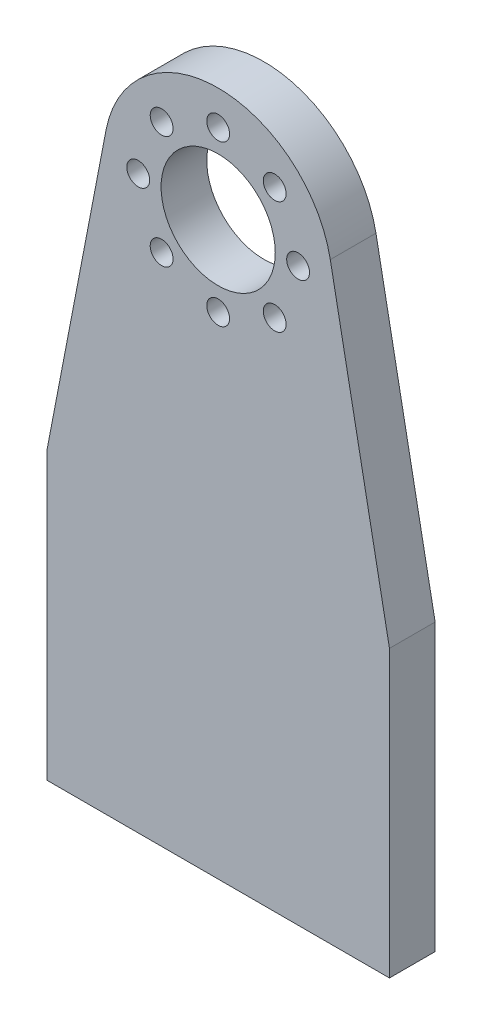
ISO-10303-21;
HEADER;
FILE_DESCRIPTION(('STEP AP214'),'2;1');
FILE_NAME('part.step','',(''),(''),'','','');
FILE_SCHEMA(('AUTOMOTIVE_DESIGN { 1 0 10303 214 1 1 1 1 }'));
ENDSEC;
DATA;
#1=APPLICATION_CONTEXT('core data for automotive mechanical design processes');
#2=APPLICATION_PROTOCOL_DEFINITION('international standard','automotive_design',2000,#1);
#3=PRODUCT_CONTEXT('',#1,'mechanical');
#4=PRODUCT('Part','Part','',(#3));
#5=PRODUCT_RELATED_PRODUCT_CATEGORY('part','',(#4));
#6=PRODUCT_DEFINITION_FORMATION('','',#4);
#7=PRODUCT_DEFINITION_CONTEXT('part definition',#1,'design');
#8=PRODUCT_DEFINITION('design','',#6,#7);
#9=PRODUCT_DEFINITION_SHAPE('','',#8);
#10=(LENGTH_UNIT() NAMED_UNIT(*) SI_UNIT(.MILLI.,.METRE.));
#11=(NAMED_UNIT(*) PLANE_ANGLE_UNIT() SI_UNIT($,.RADIAN.));
#12=(NAMED_UNIT(*) SI_UNIT($,.STERADIAN.) SOLID_ANGLE_UNIT());
#13=UNCERTAINTY_MEASURE_WITH_UNIT(LENGTH_MEASURE(1.E-05),#10,'distance_accuracy_value','');
#14=(GEOMETRIC_REPRESENTATION_CONTEXT(3) GLOBAL_UNCERTAINTY_ASSIGNED_CONTEXT((#13)) GLOBAL_UNIT_ASSIGNED_CONTEXT((#10,
#11,#12)) REPRESENTATION_CONTEXT('',''));
#15=CARTESIAN_POINT('',(0.,0.,0.));
#16=DIRECTION('',(0.,0.,1.));
#17=DIRECTION('',(1.,0.,0.));
#18=AXIS2_PLACEMENT_3D('',#15,#16,#17);
#19=CARTESIAN_POINT('',(0.,17.1036781290334,4.));
#20=DIRECTION('',(0.,0.,-1.));
#21=DIRECTION('',(-1.,0.,0.));
#22=AXIS2_PLACEMENT_3D('',#19,#20,#21);
#23=PLANE('',#22);
#24=DIRECTION('',(1.,0.,0.));
#25=VECTOR('',#24,1.);
#26=CARTESIAN_POINT('',(-15.,-32.8963218709666,4.));
#27=LINE('',#26,#25);
#28=CARTESIAN_POINT('',(-15.,-32.8963218709666,4.));
#29=VERTEX_POINT('',#28);
#30=CARTESIAN_POINT('',(15.,-32.8963218709666,4.));
#31=VERTEX_POINT('',#30);
#32=EDGE_CURVE('E128',#29,#31,#27,.T.);
#33=ORIENTED_EDGE('',*,*,#32,.T.);
#34=DIRECTION('',(0.,1.,0.));
#35=VECTOR('',#34,1.);
#36=CARTESIAN_POINT('',(15.,-7.89632187096661,4.));
#37=LINE('',#36,#35);
#38=CARTESIAN_POINT('',(15.,-7.89632187096661,4.));
#39=VERTEX_POINT('',#38);
#40=EDGE_CURVE('E86',#31,#39,#37,.T.);
#41=ORIENTED_EDGE('',*,*,#40,.T.);
#42=DIRECTION('',(-0.189166962504559,0.981944937507597,0.));
#43=VECTOR('',#42,1.);
#44=CARTESIAN_POINT('',(15.,-7.89632187096661,4.));
#45=LINE('',#44,#43);
#46=CARTESIAN_POINT('',(9.81944937507597,18.995347754079,4.));
#47=VERTEX_POINT('',#46);
#48=EDGE_CURVE('E99',#39,#47,#45,.T.);
#49=ORIENTED_EDGE('',*,*,#48,.T.);
#50=CARTESIAN_POINT('',(0.,17.1036781290334,4.));
#51=DIRECTION('',(0.,0.,1.));
#52=DIRECTION('',(-1.,0.,0.));
#53=AXIS2_PLACEMENT_3D('',#50,#51,#52);
#54=CIRCLE('',#53,9.99999999999999);
#55=CARTESIAN_POINT('',(-9.81944937507597,18.995347754079,4.));
#56=VERTEX_POINT('',#55);
#57=EDGE_CURVE('E93',#47,#56,#54,.T.);
#58=ORIENTED_EDGE('',*,*,#57,.T.);
#59=DIRECTION('',(-0.189166962504559,-0.981944937507597,0.));
#60=VECTOR('',#59,1.);
#61=CARTESIAN_POINT('',(-15.,-7.89632187096662,4.));
#62=LINE('',#61,#60);
#63=CARTESIAN_POINT('',(-15.,-7.89632187096662,4.));
#64=VERTEX_POINT('',#63);
#65=EDGE_CURVE('E97',#56,#64,#62,.T.);
#66=ORIENTED_EDGE('',*,*,#65,.T.);
#67=DIRECTION('',(0.,-1.,0.));
#68=VECTOR('',#67,1.);
#69=CARTESIAN_POINT('',(-15.,-7.89632187096662,4.));
#70=LINE('',#69,#68);
#71=EDGE_CURVE('E49',#64,#29,#70,.T.);
#72=ORIENTED_EDGE('',*,*,#71,.T.);
#73=EDGE_LOOP('',(#33,#41,#49,#58,#66,#72));
#74=FACE_BOUND('',#73,.T.);
#75=CARTESIAN_POINT('',(0.,24.1036781290334,4.));
#76=DIRECTION('',(0.,0.,1.));
#77=DIRECTION('',(1.,0.,0.));
#78=AXIS2_PLACEMENT_3D('',#75,#76,#77);
#79=CIRCLE('',#78,1.);
#80=CARTESIAN_POINT('',(1.,24.1036781290334,4.));
#81=VERTEX_POINT('',#80);
#82=EDGE_CURVE('E121',#81,#81,#79,.T.);
#83=ORIENTED_EDGE('',*,*,#82,.F.);
#84=EDGE_LOOP('',(#83));
#85=FACE_BOUND('',#84,.T.);
#86=CARTESIAN_POINT('',(0.,17.1036781290334,4.));
#87=DIRECTION('',(0.,0.,1.));
#88=DIRECTION('',(1.,0.,0.));
#89=AXIS2_PLACEMENT_3D('',#86,#87,#88);
#90=CIRCLE('',#89,5.);
#91=CARTESIAN_POINT('',(5.,17.1036781290334,4.));
#92=VERTEX_POINT('',#91);
#93=EDGE_CURVE('E242',#92,#92,#90,.T.);
#94=ORIENTED_EDGE('',*,*,#93,.F.);
#95=EDGE_LOOP('',(#94));
#96=FACE_BOUND('',#95,.T.);
#97=CARTESIAN_POINT('',(4.94974746830587,22.0534255973393,4.));
#98=DIRECTION('',(0.,0.,1.));
#99=DIRECTION('',(1.,0.,0.));
#100=AXIS2_PLACEMENT_3D('',#97,#98,#99);
#101=CIRCLE('',#100,1.);
#102=CARTESIAN_POINT('',(5.94974746830587,22.0534255973393,4.));
#103=VERTEX_POINT('',#102);
#104=EDGE_CURVE('E236',#103,#103,#101,.T.);
#105=ORIENTED_EDGE('',*,*,#104,.F.);
#106=EDGE_LOOP('',(#105));
#107=FACE_BOUND('',#106,.T.);
#108=CARTESIAN_POINT('',(7.0000000000001,17.1036781290335,4.));
#109=DIRECTION('',(0.,0.,1.));
#110=DIRECTION('',(1.,0.,0.));
#111=AXIS2_PLACEMENT_3D('',#108,#109,#110);
#112=CIRCLE('',#111,1.);
#113=CARTESIAN_POINT('',(8.0000000000001,17.1036781290335,4.));
#114=VERTEX_POINT('',#113);
#115=EDGE_CURVE('E230',#114,#114,#112,.T.);
#116=ORIENTED_EDGE('',*,*,#115,.F.);
#117=EDGE_LOOP('',(#116));
#118=FACE_BOUND('',#117,.T.);
#119=CARTESIAN_POINT('',(4.94974746830597,12.1539306607276,4.));
#120=DIRECTION('',(0.,0.,1.));
#121=DIRECTION('',(1.,0.,0.));
#122=AXIS2_PLACEMENT_3D('',#119,#120,#121);
#123=CIRCLE('',#122,1.);
#124=CARTESIAN_POINT('',(5.94974746830597,12.1539306607276,4.));
#125=VERTEX_POINT('',#124);
#126=EDGE_CURVE('E224',#125,#125,#123,.T.);
#127=ORIENTED_EDGE('',*,*,#126,.F.);
#128=EDGE_LOOP('',(#127));
#129=FACE_BOUND('',#128,.T.);
#130=CARTESIAN_POINT('',(1.46642216231412E-13,10.1036781290334,4.));
#131=DIRECTION('',(0.,0.,1.));
#132=DIRECTION('',(1.,0.,0.));
#133=AXIS2_PLACEMENT_3D('',#130,#131,#132);
#134=CIRCLE('',#133,1.);
#135=CARTESIAN_POINT('',(1.00000000000015,10.1036781290334,4.));
#136=VERTEX_POINT('',#135);
#137=EDGE_CURVE('E218',#136,#136,#134,.T.);
#138=ORIENTED_EDGE('',*,*,#137,.F.);
#139=EDGE_LOOP('',(#138));
#140=FACE_BOUND('',#139,.T.);
#141=CARTESIAN_POINT('',(-4.94974746830571,12.1539306607275,4.));
#142=DIRECTION('',(0.,0.,1.));
#143=DIRECTION('',(1.,0.,0.));
#144=AXIS2_PLACEMENT_3D('',#141,#142,#143);
#145=CIRCLE('',#144,1.);
#146=CARTESIAN_POINT('',(-3.94974746830571,12.1539306607275,4.));
#147=VERTEX_POINT('',#146);
#148=EDGE_CURVE('E212',#147,#147,#145,.T.);
#149=ORIENTED_EDGE('',*,*,#148,.F.);
#150=EDGE_LOOP('',(#149));
#151=FACE_BOUND('',#150,.T.);
#152=CARTESIAN_POINT('',(-6.9999999999999,17.1036781290334,4.));
#153=DIRECTION('',(0.,0.,1.));
#154=DIRECTION('',(1.,0.,0.));
#155=AXIS2_PLACEMENT_3D('',#152,#153,#154);
#156=CIRCLE('',#155,1.);
#157=CARTESIAN_POINT('',(-5.9999999999999,17.1036781290334,4.));
#158=VERTEX_POINT('',#157);
#159=EDGE_CURVE('E206',#158,#158,#156,.T.);
#160=ORIENTED_EDGE('',*,*,#159,.F.);
#161=EDGE_LOOP('',(#160));
#162=FACE_BOUND('',#161,.T.);
#163=CARTESIAN_POINT('',(-4.94974746830575,22.0534255973392,4.));
#164=DIRECTION('',(0.,0.,1.));
#165=DIRECTION('',(1.,0.,0.));
#166=AXIS2_PLACEMENT_3D('',#163,#164,#165);
#167=CIRCLE('',#166,1.);
#168=CARTESIAN_POINT('',(-3.94974746830575,22.0534255973392,4.));
#169=VERTEX_POINT('',#168);
#170=EDGE_CURVE('E197',#169,#169,#167,.T.);
#171=ORIENTED_EDGE('',*,*,#170,.F.);
#172=EDGE_LOOP('',(#171));
#173=FACE_BOUND('',#172,.T.);
#174=ADVANCED_FACE('F32',(#74,#85,#96,#107,#118,#129,#140,#151,#162,#173),#23,.F.);
#175=CARTESIAN_POINT('',(0.,17.1036781290334,0.));
#176=DIRECTION('',(0.,0.,-1.));
#177=DIRECTION('',(-1.,0.,0.));
#178=AXIS2_PLACEMENT_3D('',#175,#176,#177);
#179=PLANE('',#178);
#180=CARTESIAN_POINT('',(-6.9999999999999,17.1036781290334,0.));
#181=DIRECTION('',(0.,0.,1.));
#182=DIRECTION('',(1.,0.,0.));
#183=AXIS2_PLACEMENT_3D('',#180,#181,#182);
#184=CIRCLE('',#183,1.);
#185=CARTESIAN_POINT('',(-5.9999999999999,17.1036781290334,0.));
#186=VERTEX_POINT('',#185);
#187=EDGE_CURVE('E203',#186,#186,#184,.T.);
#188=ORIENTED_EDGE('',*,*,#187,.T.);
#189=EDGE_LOOP('',(#188));
#190=FACE_BOUND('',#189,.T.);
#191=CARTESIAN_POINT('',(1.46642216231412E-13,10.1036781290334,0.));
#192=DIRECTION('',(0.,0.,1.));
#193=DIRECTION('',(1.,0.,0.));
#194=AXIS2_PLACEMENT_3D('',#191,#192,#193);
#195=CIRCLE('',#194,1.);
#196=CARTESIAN_POINT('',(1.00000000000015,10.1036781290334,0.));
#197=VERTEX_POINT('',#196);
#198=EDGE_CURVE('E215',#197,#197,#195,.T.);
#199=ORIENTED_EDGE('',*,*,#198,.T.);
#200=EDGE_LOOP('',(#199));
#201=FACE_BOUND('',#200,.T.);
#202=CARTESIAN_POINT('',(7.0000000000001,17.1036781290335,0.));
#203=DIRECTION('',(0.,0.,1.));
#204=DIRECTION('',(1.,0.,0.));
#205=AXIS2_PLACEMENT_3D('',#202,#203,#204);
#206=CIRCLE('',#205,1.);
#207=CARTESIAN_POINT('',(8.0000000000001,17.1036781290335,0.));
#208=VERTEX_POINT('',#207);
#209=EDGE_CURVE('E227',#208,#208,#206,.T.);
#210=ORIENTED_EDGE('',*,*,#209,.T.);
#211=EDGE_LOOP('',(#210));
#212=FACE_BOUND('',#211,.T.);
#213=CARTESIAN_POINT('',(0.,17.1036781290334,0.));
#214=DIRECTION('',(0.,0.,1.));
#215=DIRECTION('',(1.,0.,0.));
#216=AXIS2_PLACEMENT_3D('',#213,#214,#215);
#217=CIRCLE('',#216,5.);
#218=CARTESIAN_POINT('',(5.,17.1036781290334,0.));
#219=VERTEX_POINT('',#218);
#220=EDGE_CURVE('E239',#219,#219,#217,.T.);
#221=ORIENTED_EDGE('',*,*,#220,.T.);
#222=EDGE_LOOP('',(#221));
#223=FACE_BOUND('',#222,.T.);
#224=DIRECTION('',(1.,0.,0.));
#225=VECTOR('',#224,1.);
#226=CARTESIAN_POINT('',(-15.,-32.8963218709666,0.));
#227=LINE('',#226,#225);
#228=CARTESIAN_POINT('',(-15.,-32.8963218709666,0.));
#229=VERTEX_POINT('',#228);
#230=CARTESIAN_POINT('',(15.,-32.8963218709666,0.));
#231=VERTEX_POINT('',#230);
#232=EDGE_CURVE('E117',#229,#231,#227,.T.);
#233=ORIENTED_EDGE('',*,*,#232,.F.);
#234=DIRECTION('',(0.,-1.,0.));
#235=VECTOR('',#234,1.);
#236=CARTESIAN_POINT('',(-15.,-7.89632187096662,0.));
#237=LINE('',#236,#235);
#238=CARTESIAN_POINT('',(-15.,-7.89632187096662,0.));
#239=VERTEX_POINT('',#238);
#240=EDGE_CURVE('E78',#239,#229,#237,.T.);
#241=ORIENTED_EDGE('',*,*,#240,.F.);
#242=DIRECTION('',(-0.189166962504559,-0.981944937507597,0.));
#243=VECTOR('',#242,1.);
#244=CARTESIAN_POINT('',(-15.,-7.89632187096662,0.));
#245=LINE('',#244,#243);
#246=CARTESIAN_POINT('',(-9.81944937507597,18.995347754079,0.));
#247=VERTEX_POINT('',#246);
#248=EDGE_CURVE('E72',#247,#239,#245,.T.);
#249=ORIENTED_EDGE('',*,*,#248,.F.);
#250=CARTESIAN_POINT('',(0.,17.1036781290334,0.));
#251=DIRECTION('',(0.,0.,1.));
#252=DIRECTION('',(-1.,0.,0.));
#253=AXIS2_PLACEMENT_3D('',#250,#251,#252);
#254=CIRCLE('',#253,9.99999999999999);
#255=CARTESIAN_POINT('',(9.81944937507597,18.995347754079,0.));
#256=VERTEX_POINT('',#255);
#257=EDGE_CURVE('E107',#256,#247,#254,.T.);
#258=ORIENTED_EDGE('',*,*,#257,.F.);
#259=DIRECTION('',(-0.189166962504559,0.981944937507597,0.));
#260=VECTOR('',#259,1.);
#261=CARTESIAN_POINT('',(15.,-7.89632187096661,0.));
#262=LINE('',#261,#260);
#263=CARTESIAN_POINT('',(15.,-7.89632187096661,0.));
#264=VERTEX_POINT('',#263);
#265=EDGE_CURVE('E123',#264,#256,#262,.T.);
#266=ORIENTED_EDGE('',*,*,#265,.F.);
#267=DIRECTION('',(0.,1.,0.));
#268=VECTOR('',#267,1.);
#269=CARTESIAN_POINT('',(15.,-7.89632187096661,0.));
#270=LINE('',#269,#268);
#271=EDGE_CURVE('E120',#231,#264,#270,.T.);
#272=ORIENTED_EDGE('',*,*,#271,.F.);
#273=EDGE_LOOP('',(#233,#241,#249,#258,#266,#272));
#274=FACE_BOUND('',#273,.T.);
#275=CARTESIAN_POINT('',(0.,24.1036781290334,0.));
#276=DIRECTION('',(0.,0.,1.));
#277=DIRECTION('',(1.,0.,0.));
#278=AXIS2_PLACEMENT_3D('',#275,#276,#277);
#279=CIRCLE('',#278,1.);
#280=CARTESIAN_POINT('',(1.,24.1036781290334,0.));
#281=VERTEX_POINT('',#280);
#282=EDGE_CURVE('E245',#281,#281,#279,.T.);
#283=ORIENTED_EDGE('',*,*,#282,.T.);
#284=EDGE_LOOP('',(#283));
#285=FACE_BOUND('',#284,.T.);
#286=CARTESIAN_POINT('',(4.94974746830587,22.0534255973393,0.));
#287=DIRECTION('',(0.,0.,1.));
#288=DIRECTION('',(1.,0.,0.));
#289=AXIS2_PLACEMENT_3D('',#286,#287,#288);
#290=CIRCLE('',#289,1.);
#291=CARTESIAN_POINT('',(5.94974746830587,22.0534255973393,0.));
#292=VERTEX_POINT('',#291);
#293=EDGE_CURVE('E233',#292,#292,#290,.T.);
#294=ORIENTED_EDGE('',*,*,#293,.T.);
#295=EDGE_LOOP('',(#294));
#296=FACE_BOUND('',#295,.T.);
#297=CARTESIAN_POINT('',(4.94974746830597,12.1539306607276,0.));
#298=DIRECTION('',(0.,0.,1.));
#299=DIRECTION('',(1.,0.,0.));
#300=AXIS2_PLACEMENT_3D('',#297,#298,#299);
#301=CIRCLE('',#300,1.);
#302=CARTESIAN_POINT('',(5.94974746830597,12.1539306607276,0.));
#303=VERTEX_POINT('',#302);
#304=EDGE_CURVE('E221',#303,#303,#301,.T.);
#305=ORIENTED_EDGE('',*,*,#304,.T.);
#306=EDGE_LOOP('',(#305));
#307=FACE_BOUND('',#306,.T.);
#308=CARTESIAN_POINT('',(-4.94974746830571,12.1539306607275,0.));
#309=DIRECTION('',(0.,0.,1.));
#310=DIRECTION('',(1.,0.,0.));
#311=AXIS2_PLACEMENT_3D('',#308,#309,#310);
#312=CIRCLE('',#311,1.);
#313=CARTESIAN_POINT('',(-3.94974746830571,12.1539306607275,0.));
#314=VERTEX_POINT('',#313);
#315=EDGE_CURVE('E209',#314,#314,#312,.T.);
#316=ORIENTED_EDGE('',*,*,#315,.T.);
#317=EDGE_LOOP('',(#316));
#318=FACE_BOUND('',#317,.T.);
#319=CARTESIAN_POINT('',(-4.94974746830575,22.0534255973392,0.));
#320=DIRECTION('',(0.,0.,1.));
#321=DIRECTION('',(1.,0.,0.));
#322=AXIS2_PLACEMENT_3D('',#319,#320,#321);
#323=CIRCLE('',#322,1.);
#324=CARTESIAN_POINT('',(-3.94974746830575,22.0534255973392,0.));
#325=VERTEX_POINT('',#324);
#326=EDGE_CURVE('E200',#325,#325,#323,.T.);
#327=ORIENTED_EDGE('',*,*,#326,.T.);
#328=EDGE_LOOP('',(#327));
#329=FACE_BOUND('',#328,.T.);
#330=ADVANCED_FACE('F137',(#190,#201,#212,#223,#274,#285,#296,#307,#318,#329),#179,.T.);
#331=CARTESIAN_POINT('',(-15.,-32.8963218709666,4.));
#332=DIRECTION('',(0.,1.,0.));
#333=DIRECTION('',(0.,0.,1.));
#334=AXIS2_PLACEMENT_3D('',#331,#332,#333);
#335=PLANE('',#334);
#336=ORIENTED_EDGE('',*,*,#232,.T.);
#337=DIRECTION('',(0.,0.,-1.));
#338=VECTOR('',#337,1.);
#339=CARTESIAN_POINT('',(15.,-32.8963218709666,4.));
#340=LINE('',#339,#338);
#341=EDGE_CURVE('E11',#31,#231,#340,.T.);
#342=ORIENTED_EDGE('',*,*,#341,.F.);
#343=ORIENTED_EDGE('',*,*,#32,.F.);
#344=DIRECTION('',(0.,0.,-1.));
#345=VECTOR('',#344,1.);
#346=CARTESIAN_POINT('',(-15.,-32.8963218709666,4.));
#347=LINE('',#346,#345);
#348=EDGE_CURVE('E113',#29,#229,#347,.T.);
#349=ORIENTED_EDGE('',*,*,#348,.T.);
#350=EDGE_LOOP('',(#336,#342,#343,#349));
#351=FACE_BOUND('',#350,.T.);
#352=ADVANCED_FACE('F34',(#351),#335,.F.);
#353=CARTESIAN_POINT('',(15.,-7.89632187096661,4.));
#354=DIRECTION('',(-1.,0.,0.));
#355=DIRECTION('',(0.,-1.,0.));
#356=AXIS2_PLACEMENT_3D('',#353,#354,#355);
#357=PLANE('',#356);
#358=ORIENTED_EDGE('',*,*,#271,.T.);
#359=DIRECTION('',(0.,0.,-1.));
#360=VECTOR('',#359,1.);
#361=CARTESIAN_POINT('',(15.,-7.89632187096661,4.));
#362=LINE('',#361,#360);
#363=EDGE_CURVE('E41',#39,#264,#362,.T.);
#364=ORIENTED_EDGE('',*,*,#363,.F.);
#365=ORIENTED_EDGE('',*,*,#40,.F.);
#366=ORIENTED_EDGE('',*,*,#341,.T.);
#367=EDGE_LOOP('',(#358,#364,#365,#366));
#368=FACE_BOUND('',#367,.T.);
#369=ADVANCED_FACE('F350',(#368),#357,.F.);
#370=CARTESIAN_POINT('',(15.,-7.89632187096661,4.));
#371=DIRECTION('',(-0.981944937507597,-0.189166962504559,0.));
#372=DIRECTION('',(0.189166962504559,-0.981944937507597,0.));
#373=AXIS2_PLACEMENT_3D('',#370,#371,#372);
#374=PLANE('',#373);
#375=ORIENTED_EDGE('',*,*,#265,.T.);
#376=DIRECTION('',(0.,0.,-1.));
#377=VECTOR('',#376,1.);
#378=CARTESIAN_POINT('',(9.81944937507597,18.995347754079,4.));
#379=LINE('',#378,#377);
#380=EDGE_CURVE('E108',#47,#256,#379,.T.);
#381=ORIENTED_EDGE('',*,*,#380,.F.);
#382=ORIENTED_EDGE('',*,*,#48,.F.);
#383=ORIENTED_EDGE('',*,*,#363,.T.);
#384=EDGE_LOOP('',(#375,#381,#382,#383));
#385=FACE_BOUND('',#384,.T.);
#386=ADVANCED_FACE('F134',(#385),#374,.F.);
#387=CARTESIAN_POINT('',(0.,17.1036781290334,4.));
#388=DIRECTION('',(0.,0.,-1.));
#389=DIRECTION('',(-1.,0.,0.));
#390=AXIS2_PLACEMENT_3D('',#387,#388,#389);
#391=CYLINDRICAL_SURFACE('',#390,9.99999999999999);
#392=ORIENTED_EDGE('',*,*,#257,.T.);
#393=DIRECTION('',(0.,0.,-1.));
#394=VECTOR('',#393,1.);
#395=CARTESIAN_POINT('',(-9.81944937507597,18.995347754079,4.));
#396=LINE('',#395,#394);
#397=EDGE_CURVE('E104',#56,#247,#396,.T.);
#398=ORIENTED_EDGE('',*,*,#397,.F.);
#399=ORIENTED_EDGE('',*,*,#57,.F.);
#400=ORIENTED_EDGE('',*,*,#380,.T.);
#401=EDGE_LOOP('',(#392,#398,#399,#400));
#402=FACE_BOUND('',#401,.T.);
#403=ADVANCED_FACE('F105',(#402),#391,.T.);
#404=CARTESIAN_POINT('',(-15.,-7.89632187096662,4.));
#405=DIRECTION('',(0.981944937507597,-0.189166962504559,0.));
#406=DIRECTION('',(0.189166962504559,0.981944937507597,0.));
#407=AXIS2_PLACEMENT_3D('',#404,#405,#406);
#408=PLANE('',#407);
#409=ORIENTED_EDGE('',*,*,#248,.T.);
#410=DIRECTION('',(0.,0.,-1.));
#411=VECTOR('',#410,1.);
#412=CARTESIAN_POINT('',(-15.,-7.89632187096662,4.));
#413=LINE('',#412,#411);
#414=EDGE_CURVE('E109',#64,#239,#413,.T.);
#415=ORIENTED_EDGE('',*,*,#414,.F.);
#416=ORIENTED_EDGE('',*,*,#65,.F.);
#417=ORIENTED_EDGE('',*,*,#397,.T.);
#418=EDGE_LOOP('',(#409,#415,#416,#417));
#419=FACE_BOUND('',#418,.T.);
#420=ADVANCED_FACE('F111',(#419),#408,.F.);
#421=CARTESIAN_POINT('',(-15.,-7.89632187096662,4.));
#422=DIRECTION('',(1.,0.,0.));
#423=DIRECTION('',(0.,1.,0.));
#424=AXIS2_PLACEMENT_3D('',#421,#422,#423);
#425=PLANE('',#424);
#426=ORIENTED_EDGE('',*,*,#240,.T.);
#427=ORIENTED_EDGE('',*,*,#348,.F.);
#428=ORIENTED_EDGE('',*,*,#71,.F.);
#429=ORIENTED_EDGE('',*,*,#414,.T.);
#430=EDGE_LOOP('',(#426,#427,#428,#429));
#431=FACE_BOUND('',#430,.T.);
#432=ADVANCED_FACE('F142',(#431),#425,.F.);
#433=CARTESIAN_POINT('',(0.,24.1036781290334,4.));
#434=DIRECTION('',(0.,0.,-1.));
#435=DIRECTION('',(-1.,0.,0.));
#436=AXIS2_PLACEMENT_3D('',#433,#434,#435);
#437=CYLINDRICAL_SURFACE('',#436,1.);
#438=ORIENTED_EDGE('',*,*,#82,.T.);
#439=EDGE_LOOP('',(#438));
#440=FACE_BOUND('',#439,.T.);
#441=ORIENTED_EDGE('',*,*,#282,.F.);
#442=EDGE_LOOP('',(#441));
#443=FACE_BOUND('',#442,.T.);
#444=ADVANCED_FACE('F144',(#440,#443),#437,.F.);
#445=CARTESIAN_POINT('',(0.,17.1036781290334,4.));
#446=DIRECTION('',(0.,0.,-1.));
#447=DIRECTION('',(-1.,0.,0.));
#448=AXIS2_PLACEMENT_3D('',#445,#446,#447);
#449=CYLINDRICAL_SURFACE('',#448,5.);
#450=ORIENTED_EDGE('',*,*,#93,.T.);
#451=EDGE_LOOP('',(#450));
#452=FACE_BOUND('',#451,.T.);
#453=ORIENTED_EDGE('',*,*,#220,.F.);
#454=EDGE_LOOP('',(#453));
#455=FACE_BOUND('',#454,.T.);
#456=ADVANCED_FACE('F150',(#452,#455),#449,.F.);
#457=CARTESIAN_POINT('',(4.94974746830587,22.0534255973393,4.));
#458=DIRECTION('',(0.,0.,-1.));
#459=DIRECTION('',(-1.,0.,0.));
#460=AXIS2_PLACEMENT_3D('',#457,#458,#459);
#461=CYLINDRICAL_SURFACE('',#460,1.);
#462=ORIENTED_EDGE('',*,*,#104,.T.);
#463=EDGE_LOOP('',(#462));
#464=FACE_BOUND('',#463,.T.);
#465=ORIENTED_EDGE('',*,*,#293,.F.);
#466=EDGE_LOOP('',(#465));
#467=FACE_BOUND('',#466,.T.);
#468=ADVANCED_FACE('F164',(#464,#467),#461,.F.);
#469=CARTESIAN_POINT('',(7.0000000000001,17.1036781290335,4.));
#470=DIRECTION('',(0.,0.,-1.));
#471=DIRECTION('',(-1.,0.,0.));
#472=AXIS2_PLACEMENT_3D('',#469,#470,#471);
#473=CYLINDRICAL_SURFACE('',#472,1.);
#474=ORIENTED_EDGE('',*,*,#115,.T.);
#475=EDGE_LOOP('',(#474));
#476=FACE_BOUND('',#475,.T.);
#477=ORIENTED_EDGE('',*,*,#209,.F.);
#478=EDGE_LOOP('',(#477));
#479=FACE_BOUND('',#478,.T.);
#480=ADVANCED_FACE('F168',(#476,#479),#473,.F.);
#481=CARTESIAN_POINT('',(4.94974746830597,12.1539306607276,4.));
#482=DIRECTION('',(0.,0.,-1.));
#483=DIRECTION('',(-1.,0.,0.));
#484=AXIS2_PLACEMENT_3D('',#481,#482,#483);
#485=CYLINDRICAL_SURFACE('',#484,1.);
#486=ORIENTED_EDGE('',*,*,#126,.T.);
#487=EDGE_LOOP('',(#486));
#488=FACE_BOUND('',#487,.T.);
#489=ORIENTED_EDGE('',*,*,#304,.F.);
#490=EDGE_LOOP('',(#489));
#491=FACE_BOUND('',#490,.T.);
#492=ADVANCED_FACE('F172',(#488,#491),#485,.F.);
#493=CARTESIAN_POINT('',(1.46642216231412E-13,10.1036781290334,4.));
#494=DIRECTION('',(0.,0.,-1.));
#495=DIRECTION('',(-1.,0.,0.));
#496=AXIS2_PLACEMENT_3D('',#493,#494,#495);
#497=CYLINDRICAL_SURFACE('',#496,1.);
#498=ORIENTED_EDGE('',*,*,#137,.T.);
#499=EDGE_LOOP('',(#498));
#500=FACE_BOUND('',#499,.T.);
#501=ORIENTED_EDGE('',*,*,#198,.F.);
#502=EDGE_LOOP('',(#501));
#503=FACE_BOUND('',#502,.T.);
#504=ADVANCED_FACE('F176',(#500,#503),#497,.F.);
#505=CARTESIAN_POINT('',(-4.94974746830571,12.1539306607275,4.));
#506=DIRECTION('',(0.,0.,-1.));
#507=DIRECTION('',(-1.,0.,0.));
#508=AXIS2_PLACEMENT_3D('',#505,#506,#507);
#509=CYLINDRICAL_SURFACE('',#508,1.);
#510=ORIENTED_EDGE('',*,*,#148,.T.);
#511=EDGE_LOOP('',(#510));
#512=FACE_BOUND('',#511,.T.);
#513=ORIENTED_EDGE('',*,*,#315,.F.);
#514=EDGE_LOOP('',(#513));
#515=FACE_BOUND('',#514,.T.);
#516=ADVANCED_FACE('F180',(#512,#515),#509,.F.);
#517=CARTESIAN_POINT('',(-6.9999999999999,17.1036781290334,4.));
#518=DIRECTION('',(0.,0.,-1.));
#519=DIRECTION('',(-1.,0.,0.));
#520=AXIS2_PLACEMENT_3D('',#517,#518,#519);
#521=CYLINDRICAL_SURFACE('',#520,1.);
#522=ORIENTED_EDGE('',*,*,#159,.T.);
#523=EDGE_LOOP('',(#522));
#524=FACE_BOUND('',#523,.T.);
#525=ORIENTED_EDGE('',*,*,#187,.F.);
#526=EDGE_LOOP('',(#525));
#527=FACE_BOUND('',#526,.T.);
#528=ADVANCED_FACE('F184',(#524,#527),#521,.F.);
#529=CARTESIAN_POINT('',(-4.94974746830575,22.0534255973392,4.));
#530=DIRECTION('',(0.,0.,-1.));
#531=DIRECTION('',(-1.,0.,0.));
#532=AXIS2_PLACEMENT_3D('',#529,#530,#531);
#533=CYLINDRICAL_SURFACE('',#532,1.);
#534=ORIENTED_EDGE('',*,*,#170,.T.);
#535=EDGE_LOOP('',(#534));
#536=FACE_BOUND('',#535,.T.);
#537=ORIENTED_EDGE('',*,*,#326,.F.);
#538=EDGE_LOOP('',(#537));
#539=FACE_BOUND('',#538,.T.);
#540=ADVANCED_FACE('F188',(#536,#539),#533,.F.);
#541=CLOSED_SHELL('',(#174,#330,#352,#369,#386,#403,#420,#432,#444,#456,#468,#480,#492,#504,
#516,#528,#540));
#542=MANIFOLD_SOLID_BREP('B2',#541);
#543=ADVANCED_BREP_SHAPE_REPRESENTATION('',(#18,#542),#14);
#544=SHAPE_DEFINITION_REPRESENTATION(#9,#543);
ENDSEC;
END-ISO-10303-21;
